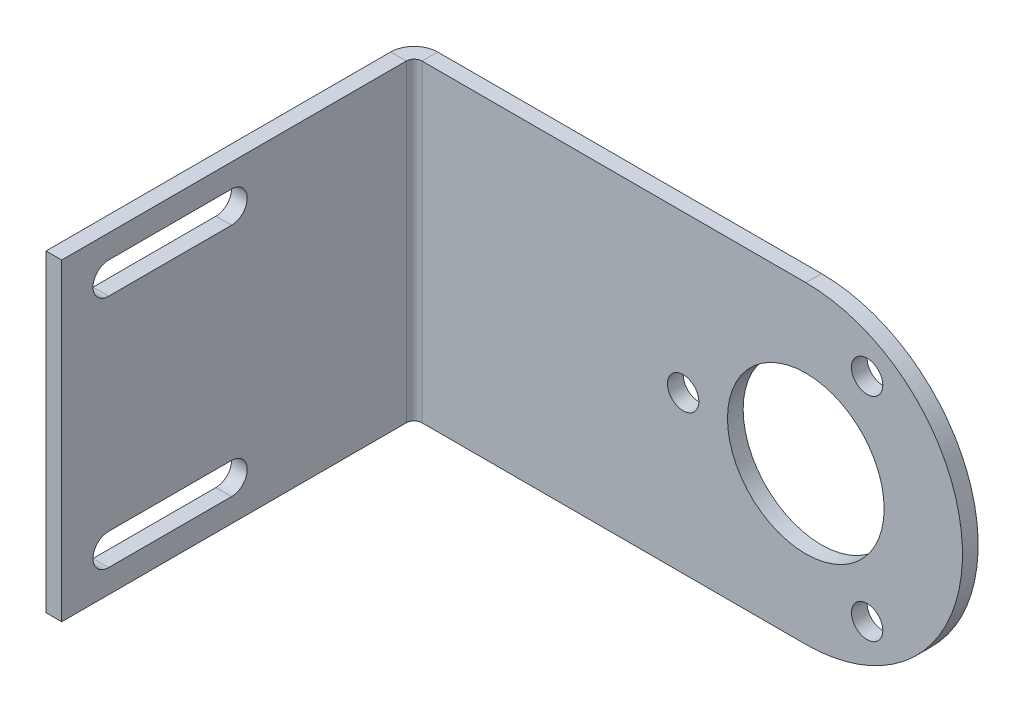
ISO-10303-21;
HEADER;
FILE_DESCRIPTION(('STEP AP214'),'2;1');
FILE_NAME('part.step','',(''),(''),'','','');
FILE_SCHEMA(('AUTOMOTIVE_DESIGN { 1 0 10303 214 1 1 1 1 }'));
ENDSEC;
DATA;
#1=APPLICATION_CONTEXT('core data for automotive mechanical design processes');
#2=APPLICATION_PROTOCOL_DEFINITION('international standard','automotive_design',2000,#1);
#3=PRODUCT_CONTEXT('',#1,'mechanical');
#4=PRODUCT('Part','Part','',(#3));
#5=PRODUCT_RELATED_PRODUCT_CATEGORY('part','',(#4));
#6=PRODUCT_DEFINITION_FORMATION('','',#4);
#7=PRODUCT_DEFINITION_CONTEXT('part definition',#1,'design');
#8=PRODUCT_DEFINITION('design','',#6,#7);
#9=PRODUCT_DEFINITION_SHAPE('','',#8);
#10=(LENGTH_UNIT() NAMED_UNIT(*) SI_UNIT(.MILLI.,.METRE.));
#11=(NAMED_UNIT(*) PLANE_ANGLE_UNIT() SI_UNIT($,.RADIAN.));
#12=(NAMED_UNIT(*) SI_UNIT($,.STERADIAN.) SOLID_ANGLE_UNIT());
#13=UNCERTAINTY_MEASURE_WITH_UNIT(LENGTH_MEASURE(1.E-05),#10,'distance_accuracy_value','');
#14=(GEOMETRIC_REPRESENTATION_CONTEXT(3) GLOBAL_UNCERTAINTY_ASSIGNED_CONTEXT((#13)) GLOBAL_UNIT_ASSIGNED_CONTEXT((#10,
#11,#12)) REPRESENTATION_CONTEXT('',''));
#15=CARTESIAN_POINT('',(0.,0.,0.));
#16=DIRECTION('',(0.,0.,1.));
#17=DIRECTION('',(1.,0.,0.));
#18=AXIS2_PLACEMENT_3D('',#15,#16,#17);
#19=CARTESIAN_POINT('',(-31.4153906803161,-30.880660626183,-2.));
#20=DIRECTION('',(0.,-1.,0.));
#21=DIRECTION('',(0.,0.,-1.));
#22=AXIS2_PLACEMENT_3D('',#19,#20,#21);
#23=PLANE('',#22);
#24=DIRECTION('',(1.,0.,0.));
#25=VECTOR('',#24,1.);
#26=CARTESIAN_POINT('',(-31.4153906803161,-30.880660626183,0.));
#27=LINE('',#26,#25);
#28=CARTESIAN_POINT('',(-30.4153906803161,-30.880660626183,0.));
#29=VERTEX_POINT('',#28);
#30=CARTESIAN_POINT('',(18.5846093196839,-30.880660626183,0.));
#31=VERTEX_POINT('',#30);
#32=EDGE_CURVE('E291',#29,#31,#27,.T.);
#33=ORIENTED_EDGE('',*,*,#32,.F.);
#34=DIRECTION('',(0.,0.,-1.));
#35=VECTOR('',#34,1.);
#36=CARTESIAN_POINT('',(-30.4153906803161,-30.880660626183,0.));
#37=LINE('',#36,#35);
#38=CARTESIAN_POINT('',(-30.4153906803161,-30.880660626183,-2.));
#39=VERTEX_POINT('',#38);
#40=EDGE_CURVE('E253',#29,#39,#37,.T.);
#41=ORIENTED_EDGE('',*,*,#40,.T.);
#42=DIRECTION('',(1.,0.,0.));
#43=VECTOR('',#42,1.);
#44=CARTESIAN_POINT('',(-31.4153906803161,-30.880660626183,-2.));
#45=LINE('',#44,#43);
#46=CARTESIAN_POINT('',(18.5846093196839,-30.880660626183,-2.));
#47=VERTEX_POINT('',#46);
#48=EDGE_CURVE('E294',#39,#47,#45,.T.);
#49=ORIENTED_EDGE('',*,*,#48,.T.);
#50=DIRECTION('',(0.,0.,1.));
#51=VECTOR('',#50,1.);
#52=CARTESIAN_POINT('',(18.5846093196839,-30.880660626183,-2.));
#53=LINE('',#52,#51);
#54=EDGE_CURVE('E40',#47,#31,#53,.T.);
#55=ORIENTED_EDGE('',*,*,#54,.T.);
#56=EDGE_LOOP('',(#33,#41,#49,#55));
#57=FACE_BOUND('',#56,.T.);
#58=ADVANCED_FACE('F37',(#57),#23,.T.);
#59=CARTESIAN_POINT('',(18.5846093196839,-10.880660626183,-2.));
#60=DIRECTION('',(0.,0.,1.));
#61=DIRECTION('',(1.,0.,0.));
#62=AXIS2_PLACEMENT_3D('',#59,#60,#61);
#63=PLANE('',#62);
#64=CARTESIAN_POINT('',(18.5846093196839,-10.880660626183,-2.));
#65=DIRECTION('',(0.,0.,1.));
#66=DIRECTION('',(1.,0.,0.));
#67=AXIS2_PLACEMENT_3D('',#64,#65,#66);
#68=CIRCLE('',#67,10.);
#69=CARTESIAN_POINT('',(28.5846093196839,-10.880660626183,-2.));
#70=VERTEX_POINT('',#69);
#71=EDGE_CURVE('E288',#70,#70,#68,.T.);
#72=ORIENTED_EDGE('',*,*,#71,.T.);
#73=EDGE_LOOP('',(#72));
#74=FACE_BOUND('',#73,.T.);
#75=CARTESIAN_POINT('',(2.92801435554655,-10.880660626183,-2.));
#76=DIRECTION('',(0.,0.,1.));
#77=DIRECTION('',(1.,0.,0.));
#78=AXIS2_PLACEMENT_3D('',#75,#76,#77);
#79=CIRCLE('',#78,2.);
#80=CARTESIAN_POINT('',(4.92801435554655,-10.880660626183,-2.));
#81=VERTEX_POINT('',#80);
#82=EDGE_CURVE('E282',#81,#81,#79,.T.);
#83=ORIENTED_EDGE('',*,*,#82,.T.);
#84=EDGE_LOOP('',(#83));
#85=FACE_BOUND('',#84,.T.);
#86=CARTESIAN_POINT('',(26.4129068017526,2.67834834952347,-2.));
#87=DIRECTION('',(0.,0.,1.));
#88=DIRECTION('',(1.,0.,0.));
#89=AXIS2_PLACEMENT_3D('',#86,#87,#88);
#90=CIRCLE('',#89,2.);
#91=CARTESIAN_POINT('',(28.4129068017526,2.67834834952347,-2.));
#92=VERTEX_POINT('',#91);
#93=EDGE_CURVE('E276',#92,#92,#90,.T.);
#94=ORIENTED_EDGE('',*,*,#93,.T.);
#95=EDGE_LOOP('',(#94));
#96=FACE_BOUND('',#95,.T.);
#97=CARTESIAN_POINT('',(26.4129068017526,-24.4396696018895,-2.));
#98=DIRECTION('',(0.,0.,1.));
#99=DIRECTION('',(1.,0.,0.));
#100=AXIS2_PLACEMENT_3D('',#97,#98,#99);
#101=CIRCLE('',#100,2.);
#102=CARTESIAN_POINT('',(28.4129068017526,-24.4396696018895,-2.));
#103=VERTEX_POINT('',#102);
#104=EDGE_CURVE('E270',#103,#103,#101,.T.);
#105=ORIENTED_EDGE('',*,*,#104,.T.);
#106=EDGE_LOOP('',(#105));
#107=FACE_BOUND('',#106,.T.);
#108=DIRECTION('',(0.,-1.,0.));
#109=VECTOR('',#108,1.);
#110=CARTESIAN_POINT('',(-30.4153906803161,-30.880660626183,-2.));
#111=LINE('',#110,#109);
#112=CARTESIAN_POINT('',(-30.4153906803161,9.119339373817,-2.));
#113=VERTEX_POINT('',#112);
#114=EDGE_CURVE('E247',#39,#113,#111,.F.);
#115=ORIENTED_EDGE('',*,*,#114,.T.);
#116=DIRECTION('',(-1.,0.,0.));
#117=VECTOR('',#116,1.);
#118=CARTESIAN_POINT('',(-31.4153906803161,9.11933937381699,-2.));
#119=LINE('',#118,#117);
#120=CARTESIAN_POINT('',(18.5846093196839,9.11933937381699,-2.));
#121=VERTEX_POINT('',#120);
#122=EDGE_CURVE('E300',#121,#113,#119,.T.);
#123=ORIENTED_EDGE('',*,*,#122,.F.);
#124=CARTESIAN_POINT('',(18.5846093196839,-10.880660626183,-2.));
#125=DIRECTION('',(0.,0.,1.));
#126=DIRECTION('',(1.,0.,0.));
#127=AXIS2_PLACEMENT_3D('',#124,#125,#126);
#128=CIRCLE('',#127,20.);
#129=EDGE_CURVE('E296',#47,#121,#128,.T.);
#130=ORIENTED_EDGE('',*,*,#129,.F.);
#131=ORIENTED_EDGE('',*,*,#48,.F.);
#132=EDGE_LOOP('',(#115,#123,#130,#131));
#133=FACE_BOUND('',#132,.T.);
#134=ADVANCED_FACE('F354',(#74,#85,#96,#107,#133),#63,.F.);
#135=CARTESIAN_POINT('',(18.5846093196839,-10.880660626183,0.));
#136=DIRECTION('',(0.,0.,1.));
#137=DIRECTION('',(1.,0.,0.));
#138=AXIS2_PLACEMENT_3D('',#135,#136,#137);
#139=PLANE('',#138);
#140=CARTESIAN_POINT('',(18.5846093196839,-10.880660626183,0.));
#141=DIRECTION('',(0.,0.,1.));
#142=DIRECTION('',(1.,0.,0.));
#143=AXIS2_PLACEMENT_3D('',#140,#141,#142);
#144=CIRCLE('',#143,10.);
#145=CARTESIAN_POINT('',(28.5846093196839,-10.880660626183,0.));
#146=VERTEX_POINT('',#145);
#147=EDGE_CURVE('E285',#146,#146,#144,.T.);
#148=ORIENTED_EDGE('',*,*,#147,.F.);
#149=EDGE_LOOP('',(#148));
#150=FACE_BOUND('',#149,.T.);
#151=CARTESIAN_POINT('',(2.92801435554655,-10.880660626183,0.));
#152=DIRECTION('',(0.,0.,1.));
#153=DIRECTION('',(1.,0.,0.));
#154=AXIS2_PLACEMENT_3D('',#151,#152,#153);
#155=CIRCLE('',#154,2.);
#156=CARTESIAN_POINT('',(4.92801435554655,-10.880660626183,0.));
#157=VERTEX_POINT('',#156);
#158=EDGE_CURVE('E279',#157,#157,#155,.T.);
#159=ORIENTED_EDGE('',*,*,#158,.F.);
#160=EDGE_LOOP('',(#159));
#161=FACE_BOUND('',#160,.T.);
#162=CARTESIAN_POINT('',(26.4129068017526,2.67834834952347,0.));
#163=DIRECTION('',(0.,0.,1.));
#164=DIRECTION('',(1.,0.,0.));
#165=AXIS2_PLACEMENT_3D('',#162,#163,#164);
#166=CIRCLE('',#165,2.);
#167=CARTESIAN_POINT('',(28.4129068017526,2.67834834952347,0.));
#168=VERTEX_POINT('',#167);
#169=EDGE_CURVE('E273',#168,#168,#166,.T.);
#170=ORIENTED_EDGE('',*,*,#169,.F.);
#171=EDGE_LOOP('',(#170));
#172=FACE_BOUND('',#171,.T.);
#173=CARTESIAN_POINT('',(26.4129068017526,-24.4396696018895,0.));
#174=DIRECTION('',(0.,0.,1.));
#175=DIRECTION('',(1.,0.,0.));
#176=AXIS2_PLACEMENT_3D('',#173,#174,#175);
#177=CIRCLE('',#176,2.);
#178=CARTESIAN_POINT('',(28.4129068017526,-24.4396696018895,0.));
#179=VERTEX_POINT('',#178);
#180=EDGE_CURVE('E267',#179,#179,#177,.T.);
#181=ORIENTED_EDGE('',*,*,#180,.F.);
#182=EDGE_LOOP('',(#181));
#183=FACE_BOUND('',#182,.T.);
#184=DIRECTION('',(-1.,0.,0.));
#185=VECTOR('',#184,1.);
#186=CARTESIAN_POINT('',(-31.4153906803161,9.11933937381699,0.));
#187=LINE('',#186,#185);
#188=CARTESIAN_POINT('',(18.5846093196839,9.11933937381699,0.));
#189=VERTEX_POINT('',#188);
#190=CARTESIAN_POINT('',(-30.4153906803161,9.11933937381699,0.));
#191=VERTEX_POINT('',#190);
#192=EDGE_CURVE('E297',#189,#191,#187,.T.);
#193=ORIENTED_EDGE('',*,*,#192,.T.);
#194=DIRECTION('',(0.,-1.,0.));
#195=VECTOR('',#194,1.);
#196=CARTESIAN_POINT('',(-30.4153906803161,-30.880660626183,0.));
#197=LINE('',#196,#195);
#198=EDGE_CURVE('E259',#29,#191,#197,.F.);
#199=ORIENTED_EDGE('',*,*,#198,.F.);
#200=ORIENTED_EDGE('',*,*,#32,.T.);
#201=CARTESIAN_POINT('',(18.5846093196839,-10.880660626183,0.));
#202=DIRECTION('',(0.,0.,1.));
#203=DIRECTION('',(1.,0.,0.));
#204=AXIS2_PLACEMENT_3D('',#201,#202,#203);
#205=CIRCLE('',#204,20.);
#206=EDGE_CURVE('E304',#31,#189,#205,.T.);
#207=ORIENTED_EDGE('',*,*,#206,.T.);
#208=EDGE_LOOP('',(#193,#199,#200,#207));
#209=FACE_BOUND('',#208,.T.);
#210=ADVANCED_FACE('F310',(#150,#161,#172,#183,#209),#139,.T.);
#211=CARTESIAN_POINT('',(-31.4153906803161,9.11933937381699,-2.));
#212=DIRECTION('',(0.,1.,0.));
#213=DIRECTION('',(0.,0.,1.));
#214=AXIS2_PLACEMENT_3D('',#211,#212,#213);
#215=PLANE('',#214);
#216=DIRECTION('',(0.,0.,-1.));
#217=VECTOR('',#216,1.);
#218=CARTESIAN_POINT('',(-30.4153906803161,9.11933937381699,0.));
#219=LINE('',#218,#217);
#220=EDGE_CURVE('E264',#191,#113,#219,.T.);
#221=ORIENTED_EDGE('',*,*,#220,.F.);
#222=ORIENTED_EDGE('',*,*,#192,.F.);
#223=DIRECTION('',(0.,0.,1.));
#224=VECTOR('',#223,1.);
#225=CARTESIAN_POINT('',(18.5846093196839,9.11933937381699,-2.));
#226=LINE('',#225,#224);
#227=EDGE_CURVE('E11',#121,#189,#226,.T.);
#228=ORIENTED_EDGE('',*,*,#227,.F.);
#229=ORIENTED_EDGE('',*,*,#122,.T.);
#230=EDGE_LOOP('',(#221,#222,#228,#229));
#231=FACE_BOUND('',#230,.T.);
#232=ADVANCED_FACE('F368',(#231),#215,.T.);
#233=CARTESIAN_POINT('',(18.5846093196839,-10.880660626183,-2.));
#234=DIRECTION('',(0.,0.,1.));
#235=DIRECTION('',(1.,0.,0.));
#236=AXIS2_PLACEMENT_3D('',#233,#234,#235);
#237=CYLINDRICAL_SURFACE('',#236,20.);
#238=ORIENTED_EDGE('',*,*,#206,.F.);
#239=ORIENTED_EDGE('',*,*,#54,.F.);
#240=ORIENTED_EDGE('',*,*,#129,.T.);
#241=ORIENTED_EDGE('',*,*,#227,.T.);
#242=EDGE_LOOP('',(#238,#239,#240,#241));
#243=FACE_BOUND('',#242,.T.);
#244=ADVANCED_FACE('F366',(#243),#237,.T.);
#245=CARTESIAN_POINT('',(18.5846093196839,-10.880660626183,-2.));
#246=DIRECTION('',(0.,0.,1.));
#247=DIRECTION('',(1.,0.,0.));
#248=AXIS2_PLACEMENT_3D('',#245,#246,#247);
#249=CYLINDRICAL_SURFACE('',#248,10.);
#250=ORIENTED_EDGE('',*,*,#71,.F.);
#251=EDGE_LOOP('',(#250));
#252=FACE_BOUND('',#251,.T.);
#253=ORIENTED_EDGE('',*,*,#147,.T.);
#254=EDGE_LOOP('',(#253));
#255=FACE_BOUND('',#254,.T.);
#256=ADVANCED_FACE('F394',(#252,#255),#249,.F.);
#257=CARTESIAN_POINT('',(2.92801435554655,-10.880660626183,-2.));
#258=DIRECTION('',(0.,0.,1.));
#259=DIRECTION('',(1.,0.,0.));
#260=AXIS2_PLACEMENT_3D('',#257,#258,#259);
#261=CYLINDRICAL_SURFACE('',#260,2.);
#262=ORIENTED_EDGE('',*,*,#82,.F.);
#263=EDGE_LOOP('',(#262));
#264=FACE_BOUND('',#263,.T.);
#265=ORIENTED_EDGE('',*,*,#158,.T.);
#266=EDGE_LOOP('',(#265));
#267=FACE_BOUND('',#266,.T.);
#268=ADVANCED_FACE('F390',(#264,#267),#261,.F.);
#269=CARTESIAN_POINT('',(26.4129068017526,2.67834834952347,-2.));
#270=DIRECTION('',(0.,0.,1.));
#271=DIRECTION('',(1.,0.,0.));
#272=AXIS2_PLACEMENT_3D('',#269,#270,#271);
#273=CYLINDRICAL_SURFACE('',#272,2.);
#274=ORIENTED_EDGE('',*,*,#93,.F.);
#275=EDGE_LOOP('',(#274));
#276=FACE_BOUND('',#275,.T.);
#277=ORIENTED_EDGE('',*,*,#169,.T.);
#278=EDGE_LOOP('',(#277));
#279=FACE_BOUND('',#278,.T.);
#280=ADVANCED_FACE('F386',(#276,#279),#273,.F.);
#281=CARTESIAN_POINT('',(26.4129068017526,-24.4396696018895,-2.));
#282=DIRECTION('',(0.,0.,1.));
#283=DIRECTION('',(1.,0.,0.));
#284=AXIS2_PLACEMENT_3D('',#281,#282,#283);
#285=CYLINDRICAL_SURFACE('',#284,2.);
#286=ORIENTED_EDGE('',*,*,#104,.F.);
#287=EDGE_LOOP('',(#286));
#288=FACE_BOUND('',#287,.T.);
#289=ORIENTED_EDGE('',*,*,#180,.T.);
#290=EDGE_LOOP('',(#289));
#291=FACE_BOUND('',#290,.T.);
#292=ADVANCED_FACE('F382',(#288,#291),#285,.F.);
#293=CARTESIAN_POINT('',(-30.4153906803161,9.11933937381699,1.));
#294=DIRECTION('',(0.,1.,0.));
#295=DIRECTION('',(0.,0.,1.));
#296=AXIS2_PLACEMENT_3D('',#293,#294,#295);
#297=PLANE('',#296);
#298=DIRECTION('',(-1.,0.,0.));
#299=VECTOR('',#298,1.);
#300=CARTESIAN_POINT('',(-31.4153906803161,9.11933937381699,0.999999999999997));
#301=LINE('',#300,#299);
#302=CARTESIAN_POINT('',(-31.4153906803161,9.11933937381699,0.999999999999997));
#303=VERTEX_POINT('',#302);
#304=CARTESIAN_POINT('',(-33.4153906803161,9.11933937381699,0.99999999999999));
#305=VERTEX_POINT('',#304);
#306=EDGE_CURVE('E210',#303,#305,#301,.T.);
#307=ORIENTED_EDGE('',*,*,#306,.F.);
#308=CARTESIAN_POINT('',(-30.4153906803161,9.11933937381699,1.));
#309=DIRECTION('',(0.,-1.,0.));
#310=DIRECTION('',(0.,0.,-1.));
#311=AXIS2_PLACEMENT_3D('',#308,#309,#310);
#312=CIRCLE('',#311,1.);
#313=EDGE_CURVE('E256',#191,#303,#312,.F.);
#314=ORIENTED_EDGE('',*,*,#313,.F.);
#315=ORIENTED_EDGE('',*,*,#220,.T.);
#316=CARTESIAN_POINT('',(-30.4153906803161,9.11933937381699,1.));
#317=DIRECTION('',(0.,-1.,0.));
#318=DIRECTION('',(0.,0.,-1.));
#319=AXIS2_PLACEMENT_3D('',#316,#317,#318);
#320=CIRCLE('',#319,3.);
#321=EDGE_CURVE('E249',#113,#305,#320,.F.);
#322=ORIENTED_EDGE('',*,*,#321,.T.);
#323=EDGE_LOOP('',(#307,#314,#315,#322));
#324=FACE_BOUND('',#323,.T.);
#325=ADVANCED_FACE('F320',(#324),#297,.T.);
#326=CARTESIAN_POINT('',(-30.4153906803161,-30.880660626183,1.));
#327=DIRECTION('',(0.,1.,0.));
#328=DIRECTION('',(0.,0.,1.));
#329=AXIS2_PLACEMENT_3D('',#326,#327,#328);
#330=PLANE('',#329);
#331=CARTESIAN_POINT('',(-30.4153906803161,-30.880660626183,1.));
#332=DIRECTION('',(0.,-1.,0.));
#333=DIRECTION('',(0.,0.,-1.));
#334=AXIS2_PLACEMENT_3D('',#331,#332,#333);
#335=CIRCLE('',#334,1.);
#336=CARTESIAN_POINT('',(-31.4153906803161,-30.880660626183,0.999999999999997));
#337=VERTEX_POINT('',#336);
#338=EDGE_CURVE('E246',#337,#29,#335,.T.);
#339=ORIENTED_EDGE('',*,*,#338,.F.);
#340=DIRECTION('',(-1.,0.,0.));
#341=VECTOR('',#340,1.);
#342=CARTESIAN_POINT('',(-31.4153906803161,-30.880660626183,0.999999999999997));
#343=LINE('',#342,#341);
#344=CARTESIAN_POINT('',(-33.4153906803161,-30.880660626183,0.99999999999999));
#345=VERTEX_POINT('',#344);
#346=EDGE_CURVE('E219',#337,#345,#343,.T.);
#347=ORIENTED_EDGE('',*,*,#346,.T.);
#348=CARTESIAN_POINT('',(-30.4153906803161,-30.880660626183,1.));
#349=DIRECTION('',(0.,-1.,0.));
#350=DIRECTION('',(0.,0.,-1.));
#351=AXIS2_PLACEMENT_3D('',#348,#349,#350);
#352=CIRCLE('',#351,3.);
#353=EDGE_CURVE('E250',#345,#39,#352,.T.);
#354=ORIENTED_EDGE('',*,*,#353,.T.);
#355=ORIENTED_EDGE('',*,*,#40,.F.);
#356=EDGE_LOOP('',(#339,#347,#354,#355));
#357=FACE_BOUND('',#356,.T.);
#358=ADVANCED_FACE('F341',(#357),#330,.F.);
#359=CARTESIAN_POINT('',(-30.4153906803161,-30.880660626183,1.));
#360=DIRECTION('',(0.,-1.,0.));
#361=DIRECTION('',(-1.,0.,0.));
#362=AXIS2_PLACEMENT_3D('',#359,#360,#361);
#363=CYLINDRICAL_SURFACE('',#362,3.);
#364=ORIENTED_EDGE('',*,*,#114,.F.);
#365=ORIENTED_EDGE('',*,*,#353,.F.);
#366=DIRECTION('',(0.,1.,0.));
#367=VECTOR('',#366,1.);
#368=CARTESIAN_POINT('',(-33.4153906803161,0.,0.99999999999999));
#369=LINE('',#368,#367);
#370=EDGE_CURVE('E222',#345,#305,#369,.T.);
#371=ORIENTED_EDGE('',*,*,#370,.T.);
#372=ORIENTED_EDGE('',*,*,#321,.F.);
#373=EDGE_LOOP('',(#364,#365,#371,#372));
#374=FACE_BOUND('',#373,.T.);
#375=ADVANCED_FACE('F371',(#374),#363,.T.);
#376=CARTESIAN_POINT('',(-30.4153906803161,-30.880660626183,1.));
#377=DIRECTION('',(0.,-1.,0.));
#378=DIRECTION('',(-1.,0.,0.));
#379=AXIS2_PLACEMENT_3D('',#376,#377,#378);
#380=CYLINDRICAL_SURFACE('',#379,1.);
#381=ORIENTED_EDGE('',*,*,#198,.T.);
#382=ORIENTED_EDGE('',*,*,#313,.T.);
#383=DIRECTION('',(0.,-1.,0.));
#384=VECTOR('',#383,1.);
#385=CARTESIAN_POINT('',(-31.4153906803161,9.11933937381699,0.999999999999997));
#386=LINE('',#385,#384);
#387=EDGE_CURVE('E217',#303,#337,#386,.T.);
#388=ORIENTED_EDGE('',*,*,#387,.T.);
#389=ORIENTED_EDGE('',*,*,#338,.T.);
#390=EDGE_LOOP('',(#381,#382,#388,#389));
#391=FACE_BOUND('',#390,.T.);
#392=ADVANCED_FACE('F316',(#391),#380,.F.);
#393=CARTESIAN_POINT('',(-33.4153906803161,9.11933937381699,0.));
#394=DIRECTION('',(0.,-1.,0.));
#395=DIRECTION('',(1.,0.,0.));
#396=AXIS2_PLACEMENT_3D('',#393,#394,#395);
#397=PLANE('',#396);
#398=ORIENTED_EDGE('',*,*,#306,.T.);
#399=DIRECTION('',(0.,0.,-1.));
#400=VECTOR('',#399,1.);
#401=CARTESIAN_POINT('',(-33.4153906803161,9.11933937381699,0.));
#402=LINE('',#401,#400);
#403=CARTESIAN_POINT('',(-33.4153906803162,9.11933937381699,45.));
#404=VERTEX_POINT('',#403);
#405=EDGE_CURVE('E227',#404,#305,#402,.T.);
#406=ORIENTED_EDGE('',*,*,#405,.F.);
#407=DIRECTION('',(1.,0.,0.));
#408=VECTOR('',#407,1.);
#409=CARTESIAN_POINT('',(-33.4153906803162,9.11933937381699,45.));
#410=LINE('',#409,#408);
#411=CARTESIAN_POINT('',(-31.4153906803162,9.11933937381699,45.));
#412=VERTEX_POINT('',#411);
#413=EDGE_CURVE('E235',#404,#412,#410,.T.);
#414=ORIENTED_EDGE('',*,*,#413,.T.);
#415=DIRECTION('',(0.,0.,-1.));
#416=VECTOR('',#415,1.);
#417=CARTESIAN_POINT('',(-31.4153906803161,9.11933937381699,0.));
#418=LINE('',#417,#416);
#419=EDGE_CURVE('E226',#412,#303,#418,.T.);
#420=ORIENTED_EDGE('',*,*,#419,.T.);
#421=EDGE_LOOP('',(#398,#406,#414,#420));
#422=FACE_BOUND('',#421,.T.);
#423=ADVANCED_FACE('F324',(#422),#397,.F.);
#424=CARTESIAN_POINT('',(-33.4153906803162,-30.880660626183,45.));
#425=DIRECTION('',(0.,1.,0.));
#426=DIRECTION('',(-1.,0.,0.));
#427=AXIS2_PLACEMENT_3D('',#424,#425,#426);
#428=PLANE('',#427);
#429=ORIENTED_EDGE('',*,*,#346,.F.);
#430=DIRECTION('',(0.,0.,1.));
#431=VECTOR('',#430,1.);
#432=CARTESIAN_POINT('',(-31.4153906803162,-30.880660626183,45.));
#433=LINE('',#432,#431);
#434=CARTESIAN_POINT('',(-31.4153906803162,-30.880660626183,45.));
#435=VERTEX_POINT('',#434);
#436=EDGE_CURVE('E238',#337,#435,#433,.T.);
#437=ORIENTED_EDGE('',*,*,#436,.T.);
#438=DIRECTION('',(1.,0.,0.));
#439=VECTOR('',#438,1.);
#440=CARTESIAN_POINT('',(-33.4153906803162,-30.880660626183,45.));
#441=LINE('',#440,#439);
#442=CARTESIAN_POINT('',(-33.4153906803162,-30.880660626183,45.));
#443=VERTEX_POINT('',#442);
#444=EDGE_CURVE('E243',#443,#435,#441,.T.);
#445=ORIENTED_EDGE('',*,*,#444,.F.);
#446=DIRECTION('',(0.,0.,1.));
#447=VECTOR('',#446,1.);
#448=CARTESIAN_POINT('',(-33.4153906803162,-30.880660626183,45.));
#449=LINE('',#448,#447);
#450=EDGE_CURVE('E230',#345,#443,#449,.T.);
#451=ORIENTED_EDGE('',*,*,#450,.F.);
#452=EDGE_LOOP('',(#429,#437,#445,#451));
#453=FACE_BOUND('',#452,.T.);
#454=ADVANCED_FACE('F343',(#453),#428,.F.);
#455=CARTESIAN_POINT('',(-33.4153906803161,0.,-1.18399083705502E-13));
#456=DIRECTION('',(1.,0.,0.));
#457=DIRECTION('',(0.,0.,-1.));
#458=AXIS2_PLACEMENT_3D('',#455,#456,#457);
#459=PLANE('',#458);
#460=DIRECTION('',(0.,0.,1.));
#461=VECTOR('',#460,1.);
#462=CARTESIAN_POINT('',(-33.4153906803164,-23.880660626183,39.));
#463=LINE('',#462,#461);
#464=CARTESIAN_POINT('',(-33.4153906803163,-23.880660626183,23.3139246124321));
#465=VERTEX_POINT('',#464);
#466=CARTESIAN_POINT('',(-33.4153906803164,-23.880660626183,39.));
#467=VERTEX_POINT('',#466);
#468=EDGE_CURVE('E156',#465,#467,#463,.T.);
#469=ORIENTED_EDGE('',*,*,#468,.T.);
#470=CARTESIAN_POINT('',(-33.4153906803164,-25.880660626183,39.));
#471=DIRECTION('',(1.,0.,0.));
#472=DIRECTION('',(0.,0.,1.));
#473=AXIS2_PLACEMENT_3D('',#470,#471,#472);
#474=CIRCLE('',#473,2.);
#475=CARTESIAN_POINT('',(-33.4153906803164,-27.880660626183,39.));
#476=VERTEX_POINT('',#475);
#477=EDGE_CURVE('E150',#467,#476,#474,.T.);
#478=ORIENTED_EDGE('',*,*,#477,.T.);
#479=DIRECTION('',(0.,0.,-1.));
#480=VECTOR('',#479,1.);
#481=CARTESIAN_POINT('',(-33.4153906803164,-27.880660626183,39.));
#482=LINE('',#481,#480);
#483=CARTESIAN_POINT('',(-33.4153906803162,-27.880660626183,23.3139246124321));
#484=VERTEX_POINT('',#483);
#485=EDGE_CURVE('E159',#476,#484,#482,.T.);
#486=ORIENTED_EDGE('',*,*,#485,.T.);
#487=CARTESIAN_POINT('',(-33.4153906803163,-25.880660626183,23.3139246124321));
#488=DIRECTION('',(1.,0.,0.));
#489=DIRECTION('',(0.,0.,1.));
#490=AXIS2_PLACEMENT_3D('',#487,#488,#489);
#491=CIRCLE('',#490,1.99999999999999);
#492=EDGE_CURVE('E51',#484,#465,#491,.T.);
#493=ORIENTED_EDGE('',*,*,#492,.T.);
#494=EDGE_LOOP('',(#469,#478,#486,#493));
#495=FACE_BOUND('',#494,.T.);
#496=DIRECTION('',(0.,0.,1.));
#497=VECTOR('',#496,1.);
#498=CARTESIAN_POINT('',(-33.4153906803164,6.11933937381699,39.));
#499=LINE('',#498,#497);
#500=CARTESIAN_POINT('',(-33.4153906803163,6.11933937381699,23.3139246124321));
#501=VERTEX_POINT('',#500);
#502=CARTESIAN_POINT('',(-33.4153906803164,6.11933937381699,39.));
#503=VERTEX_POINT('',#502);
#504=EDGE_CURVE('E195',#501,#503,#499,.T.);
#505=ORIENTED_EDGE('',*,*,#504,.T.);
#506=CARTESIAN_POINT('',(-33.4153906803164,4.11933937381699,39.));
#507=DIRECTION('',(1.,0.,0.));
#508=DIRECTION('',(0.,0.,-1.));
#509=AXIS2_PLACEMENT_3D('',#506,#507,#508);
#510=CIRCLE('',#509,2.);
#511=CARTESIAN_POINT('',(-33.4153906803164,2.11933937381699,39.));
#512=VERTEX_POINT('',#511);
#513=EDGE_CURVE('E185',#503,#512,#510,.T.);
#514=ORIENTED_EDGE('',*,*,#513,.T.);
#515=DIRECTION('',(0.,0.,-1.));
#516=VECTOR('',#515,1.);
#517=CARTESIAN_POINT('',(-33.4153906803164,2.11933937381699,39.));
#518=LINE('',#517,#516);
#519=CARTESIAN_POINT('',(-33.4153906803162,2.119339373817,23.3139246124321));
#520=VERTEX_POINT('',#519);
#521=EDGE_CURVE('E188',#512,#520,#518,.T.);
#522=ORIENTED_EDGE('',*,*,#521,.T.);
#523=CARTESIAN_POINT('',(-33.4153906803163,4.11933937381699,23.3139246124321));
#524=DIRECTION('',(1.,0.,0.));
#525=DIRECTION('',(0.,0.,-1.));
#526=AXIS2_PLACEMENT_3D('',#523,#524,#525);
#527=CIRCLE('',#526,2.);
#528=EDGE_CURVE('E192',#520,#501,#527,.T.);
#529=ORIENTED_EDGE('',*,*,#528,.T.);
#530=EDGE_LOOP('',(#505,#514,#522,#529));
#531=FACE_BOUND('',#530,.T.);
#532=ORIENTED_EDGE('',*,*,#370,.F.);
#533=ORIENTED_EDGE('',*,*,#450,.T.);
#534=DIRECTION('',(0.,1.,0.));
#535=VECTOR('',#534,1.);
#536=CARTESIAN_POINT('',(-33.4153906803162,9.11933937381699,45.));
#537=LINE('',#536,#535);
#538=EDGE_CURVE('E233',#443,#404,#537,.T.);
#539=ORIENTED_EDGE('',*,*,#538,.T.);
#540=ORIENTED_EDGE('',*,*,#405,.T.);
#541=EDGE_LOOP('',(#532,#533,#539,#540));
#542=FACE_BOUND('',#541,.T.);
#543=ADVANCED_FACE('F163',(#495,#531,#542),#459,.F.);
#544=CARTESIAN_POINT('',(-31.4153906803161,0.,-1.11416121027816E-13));
#545=DIRECTION('',(1.,0.,0.));
#546=DIRECTION('',(0.,0.,-1.));
#547=AXIS2_PLACEMENT_3D('',#544,#545,#546);
#548=PLANE('',#547);
#549=CARTESIAN_POINT('',(-31.4153906803162,-25.880660626183,39.));
#550=DIRECTION('',(1.,0.,0.));
#551=DIRECTION('',(0.,0.,1.));
#552=AXIS2_PLACEMENT_3D('',#549,#550,#551);
#553=CIRCLE('',#552,2.);
#554=CARTESIAN_POINT('',(-31.4153906803162,-23.880660626183,39.));
#555=VERTEX_POINT('',#554);
#556=CARTESIAN_POINT('',(-31.4153906803162,-27.880660626183,39.));
#557=VERTEX_POINT('',#556);
#558=EDGE_CURVE('E59',#555,#557,#553,.T.);
#559=ORIENTED_EDGE('',*,*,#558,.F.);
#560=DIRECTION('',(0.,0.,1.));
#561=VECTOR('',#560,1.);
#562=CARTESIAN_POINT('',(-31.4153906803162,-23.880660626183,39.));
#563=LINE('',#562,#561);
#564=CARTESIAN_POINT('',(-31.4153906803162,-23.880660626183,23.3139246124321));
#565=VERTEX_POINT('',#564);
#566=EDGE_CURVE('E166',#565,#555,#563,.T.);
#567=ORIENTED_EDGE('',*,*,#566,.F.);
#568=CARTESIAN_POINT('',(-31.4153906803162,-25.880660626183,23.3139246124321));
#569=DIRECTION('',(1.,0.,0.));
#570=DIRECTION('',(0.,0.,1.));
#571=AXIS2_PLACEMENT_3D('',#568,#569,#570);
#572=CIRCLE('',#571,1.99999999999999);
#573=CARTESIAN_POINT('',(-31.4153906803162,-27.880660626183,23.3139246124321));
#574=VERTEX_POINT('',#573);
#575=EDGE_CURVE('E169',#574,#565,#572,.T.);
#576=ORIENTED_EDGE('',*,*,#575,.F.);
#577=DIRECTION('',(0.,0.,-1.));
#578=VECTOR('',#577,1.);
#579=CARTESIAN_POINT('',(-31.4153906803162,-27.880660626183,39.));
#580=LINE('',#579,#578);
#581=EDGE_CURVE('E175',#557,#574,#580,.T.);
#582=ORIENTED_EDGE('',*,*,#581,.F.);
#583=EDGE_LOOP('',(#559,#567,#576,#582));
#584=FACE_BOUND('',#583,.T.);
#585=CARTESIAN_POINT('',(-31.4153906803162,4.11933937381699,39.));
#586=DIRECTION('',(1.,0.,0.));
#587=DIRECTION('',(0.,0.,-1.));
#588=AXIS2_PLACEMENT_3D('',#585,#586,#587);
#589=CIRCLE('',#588,2.);
#590=CARTESIAN_POINT('',(-31.4153906803162,6.11933937381699,39.));
#591=VERTEX_POINT('',#590);
#592=CARTESIAN_POINT('',(-31.4153906803162,2.11933937381699,39.));
#593=VERTEX_POINT('',#592);
#594=EDGE_CURVE('E181',#591,#593,#589,.T.);
#595=ORIENTED_EDGE('',*,*,#594,.F.);
#596=DIRECTION('',(0.,0.,1.));
#597=VECTOR('',#596,1.);
#598=CARTESIAN_POINT('',(-31.4153906803162,6.11933937381699,39.));
#599=LINE('',#598,#597);
#600=CARTESIAN_POINT('',(-31.4153906803162,6.11933937381699,23.3139246124321));
#601=VERTEX_POINT('',#600);
#602=EDGE_CURVE('E189',#601,#591,#599,.T.);
#603=ORIENTED_EDGE('',*,*,#602,.F.);
#604=CARTESIAN_POINT('',(-31.4153906803162,4.11933937381699,23.3139246124321));
#605=DIRECTION('',(1.,0.,0.));
#606=DIRECTION('',(0.,0.,-1.));
#607=AXIS2_PLACEMENT_3D('',#604,#605,#606);
#608=CIRCLE('',#607,2.);
#609=CARTESIAN_POINT('',(-31.4153906803162,2.119339373817,23.3139246124321));
#610=VERTEX_POINT('',#609);
#611=EDGE_CURVE('E203',#610,#601,#608,.T.);
#612=ORIENTED_EDGE('',*,*,#611,.F.);
#613=DIRECTION('',(0.,0.,-1.));
#614=VECTOR('',#613,1.);
#615=CARTESIAN_POINT('',(-31.4153906803162,2.11933937381699,39.));
#616=LINE('',#615,#614);
#617=EDGE_CURVE('E200',#593,#610,#616,.T.);
#618=ORIENTED_EDGE('',*,*,#617,.F.);
#619=EDGE_LOOP('',(#595,#603,#612,#618));
#620=FACE_BOUND('',#619,.T.);
#621=ORIENTED_EDGE('',*,*,#436,.F.);
#622=ORIENTED_EDGE('',*,*,#387,.F.);
#623=ORIENTED_EDGE('',*,*,#419,.F.);
#624=DIRECTION('',(0.,1.,0.));
#625=VECTOR('',#624,1.);
#626=CARTESIAN_POINT('',(-31.4153906803162,9.11933937381699,45.));
#627=LINE('',#626,#625);
#628=EDGE_CURVE('E231',#435,#412,#627,.T.);
#629=ORIENTED_EDGE('',*,*,#628,.F.);
#630=EDGE_LOOP('',(#621,#622,#623,#629));
#631=FACE_BOUND('',#630,.T.);
#632=ADVANCED_FACE('F337',(#584,#620,#631),#548,.T.);
#633=CARTESIAN_POINT('',(-33.4153906803162,9.11933937381699,45.));
#634=DIRECTION('',(0.,0.,-1.));
#635=DIRECTION('',(-1.,0.,0.));
#636=AXIS2_PLACEMENT_3D('',#633,#634,#635);
#637=PLANE('',#636);
#638=ORIENTED_EDGE('',*,*,#628,.T.);
#639=ORIENTED_EDGE('',*,*,#413,.F.);
#640=ORIENTED_EDGE('',*,*,#538,.F.);
#641=ORIENTED_EDGE('',*,*,#444,.T.);
#642=EDGE_LOOP('',(#638,#639,#640,#641));
#643=FACE_BOUND('',#642,.T.);
#644=ADVANCED_FACE('F333',(#643),#637,.F.);
#645=CARTESIAN_POINT('',(-33.4153906803164,4.11933937381699,39.));
#646=DIRECTION('',(1.,0.,0.));
#647=DIRECTION('',(0.,0.,-1.));
#648=AXIS2_PLACEMENT_3D('',#645,#646,#647);
#649=CYLINDRICAL_SURFACE('',#648,2.);
#650=ORIENTED_EDGE('',*,*,#594,.T.);
#651=DIRECTION('',(1.,0.,0.));
#652=VECTOR('',#651,1.);
#653=CARTESIAN_POINT('',(-33.4153906803164,2.11933937381699,39.));
#654=LINE('',#653,#652);
#655=EDGE_CURVE('E198',#512,#593,#654,.T.);
#656=ORIENTED_EDGE('',*,*,#655,.F.);
#657=ORIENTED_EDGE('',*,*,#513,.F.);
#658=DIRECTION('',(1.,0.,0.));
#659=VECTOR('',#658,1.);
#660=CARTESIAN_POINT('',(-33.4153906803164,6.11933937381699,39.));
#661=LINE('',#660,#659);
#662=EDGE_CURVE('E208',#503,#591,#661,.T.);
#663=ORIENTED_EDGE('',*,*,#662,.T.);
#664=EDGE_LOOP('',(#650,#656,#657,#663));
#665=FACE_BOUND('',#664,.T.);
#666=ADVANCED_FACE('F467',(#665),#649,.F.);
#667=CARTESIAN_POINT('',(-33.4153906803164,6.11933937381699,39.));
#668=DIRECTION('',(0.,1.,0.));
#669=DIRECTION('',(-1.,0.,0.));
#670=AXIS2_PLACEMENT_3D('',#667,#668,#669);
#671=PLANE('',#670);
#672=ORIENTED_EDGE('',*,*,#602,.T.);
#673=ORIENTED_EDGE('',*,*,#662,.F.);
#674=ORIENTED_EDGE('',*,*,#504,.F.);
#675=DIRECTION('',(1.,0.,0.));
#676=VECTOR('',#675,1.);
#677=CARTESIAN_POINT('',(-33.4153906803163,6.11933937381699,23.3139246124321));
#678=LINE('',#677,#676);
#679=EDGE_CURVE('E211',#501,#601,#678,.T.);
#680=ORIENTED_EDGE('',*,*,#679,.T.);
#681=EDGE_LOOP('',(#672,#673,#674,#680));
#682=FACE_BOUND('',#681,.T.);
#683=ADVANCED_FACE('F492',(#682),#671,.F.);
#684=CARTESIAN_POINT('',(-33.4153906803163,4.11933937381699,23.3139246124321));
#685=DIRECTION('',(1.,0.,0.));
#686=DIRECTION('',(0.,0.,-1.));
#687=AXIS2_PLACEMENT_3D('',#684,#685,#686);
#688=CYLINDRICAL_SURFACE('',#687,2.);
#689=ORIENTED_EDGE('',*,*,#611,.T.);
#690=ORIENTED_EDGE('',*,*,#679,.F.);
#691=ORIENTED_EDGE('',*,*,#528,.F.);
#692=DIRECTION('',(1.,0.,0.));
#693=VECTOR('',#692,1.);
#694=CARTESIAN_POINT('',(-33.4153906803163,2.119339373817,23.3139246124321));
#695=LINE('',#694,#693);
#696=EDGE_CURVE('E213',#520,#610,#695,.T.);
#697=ORIENTED_EDGE('',*,*,#696,.T.);
#698=EDGE_LOOP('',(#689,#690,#691,#697));
#699=FACE_BOUND('',#698,.T.);
#700=ADVANCED_FACE('F503',(#699),#688,.F.);
#701=CARTESIAN_POINT('',(-33.4153906803164,2.11933937381699,39.));
#702=DIRECTION('',(0.,-1.,0.));
#703=DIRECTION('',(0.,0.,-1.));
#704=AXIS2_PLACEMENT_3D('',#701,#702,#703);
#705=PLANE('',#704);
#706=ORIENTED_EDGE('',*,*,#617,.T.);
#707=ORIENTED_EDGE('',*,*,#696,.F.);
#708=ORIENTED_EDGE('',*,*,#521,.F.);
#709=ORIENTED_EDGE('',*,*,#655,.T.);
#710=EDGE_LOOP('',(#706,#707,#708,#709));
#711=FACE_BOUND('',#710,.T.);
#712=ADVANCED_FACE('F514',(#711),#705,.F.);
#713=CARTESIAN_POINT('',(-33.4153906803164,-25.880660626183,39.));
#714=DIRECTION('',(1.,0.,0.));
#715=DIRECTION('',(0.,0.,-1.));
#716=AXIS2_PLACEMENT_3D('',#713,#714,#715);
#717=CYLINDRICAL_SURFACE('',#716,2.);
#718=ORIENTED_EDGE('',*,*,#558,.T.);
#719=DIRECTION('',(1.,0.,0.));
#720=VECTOR('',#719,1.);
#721=CARTESIAN_POINT('',(-33.4153906803164,-27.880660626183,39.));
#722=LINE('',#721,#720);
#723=EDGE_CURVE('E146',#476,#557,#722,.T.);
#724=ORIENTED_EDGE('',*,*,#723,.F.);
#725=ORIENTED_EDGE('',*,*,#477,.F.);
#726=DIRECTION('',(1.,0.,0.));
#727=VECTOR('',#726,1.);
#728=CARTESIAN_POINT('',(-33.4153906803164,-23.880660626183,39.));
#729=LINE('',#728,#727);
#730=EDGE_CURVE('E179',#467,#555,#729,.T.);
#731=ORIENTED_EDGE('',*,*,#730,.T.);
#732=EDGE_LOOP('',(#718,#724,#725,#731));
#733=FACE_BOUND('',#732,.T.);
#734=ADVANCED_FACE('F148',(#733),#717,.F.);
#735=CARTESIAN_POINT('',(-33.4153906803164,-23.880660626183,39.));
#736=DIRECTION('',(0.,1.,0.));
#737=DIRECTION('',(0.,0.,1.));
#738=AXIS2_PLACEMENT_3D('',#735,#736,#737);
#739=PLANE('',#738);
#740=ORIENTED_EDGE('',*,*,#566,.T.);
#741=ORIENTED_EDGE('',*,*,#730,.F.);
#742=ORIENTED_EDGE('',*,*,#468,.F.);
#743=DIRECTION('',(1.,0.,0.));
#744=VECTOR('',#743,1.);
#745=CARTESIAN_POINT('',(-33.4153906803163,-23.880660626183,23.3139246124321));
#746=LINE('',#745,#744);
#747=EDGE_CURVE('E182',#465,#565,#746,.T.);
#748=ORIENTED_EDGE('',*,*,#747,.T.);
#749=EDGE_LOOP('',(#740,#741,#742,#748));
#750=FACE_BOUND('',#749,.T.);
#751=ADVANCED_FACE('F535',(#750),#739,.F.);
#752=CARTESIAN_POINT('',(-33.4153906803163,-25.880660626183,23.3139246124321));
#753=DIRECTION('',(1.,0.,0.));
#754=DIRECTION('',(0.,0.,-1.));
#755=AXIS2_PLACEMENT_3D('',#752,#753,#754);
#756=CYLINDRICAL_SURFACE('',#755,1.99999999999999);
#757=ORIENTED_EDGE('',*,*,#575,.T.);
#758=ORIENTED_EDGE('',*,*,#747,.F.);
#759=ORIENTED_EDGE('',*,*,#492,.F.);
#760=DIRECTION('',(1.,0.,0.));
#761=VECTOR('',#760,1.);
#762=CARTESIAN_POINT('',(-33.4153906803163,-27.880660626183,23.3139246124321));
#763=LINE('',#762,#761);
#764=EDGE_CURVE('E155',#484,#574,#763,.T.);
#765=ORIENTED_EDGE('',*,*,#764,.T.);
#766=EDGE_LOOP('',(#757,#758,#759,#765));
#767=FACE_BOUND('',#766,.T.);
#768=ADVANCED_FACE('F545',(#767),#756,.F.);
#769=CARTESIAN_POINT('',(-33.4153906803164,-27.880660626183,39.));
#770=DIRECTION('',(0.,-1.,0.));
#771=DIRECTION('',(1.,0.,0.));
#772=AXIS2_PLACEMENT_3D('',#769,#770,#771);
#773=PLANE('',#772);
#774=ORIENTED_EDGE('',*,*,#581,.T.);
#775=ORIENTED_EDGE('',*,*,#764,.F.);
#776=ORIENTED_EDGE('',*,*,#485,.F.);
#777=ORIENTED_EDGE('',*,*,#723,.T.);
#778=EDGE_LOOP('',(#774,#775,#776,#777));
#779=FACE_BOUND('',#778,.T.);
#780=ADVANCED_FACE('F160',(#779),#773,.F.);
#781=CLOSED_SHELL('',(#58,#134,#210,#232,#244,#256,#268,#280,#292,#325,#358,#375,#392,#423,#454,
#543,#632,#644,#666,#683,#700,#712,#734,#751,#768,#780));
#782=MANIFOLD_SOLID_BREP('B2',#781);
#783=ADVANCED_BREP_SHAPE_REPRESENTATION('',(#18,#782),#14);
#784=SHAPE_DEFINITION_REPRESENTATION(#9,#783);
ENDSEC;
END-ISO-10303-21;
